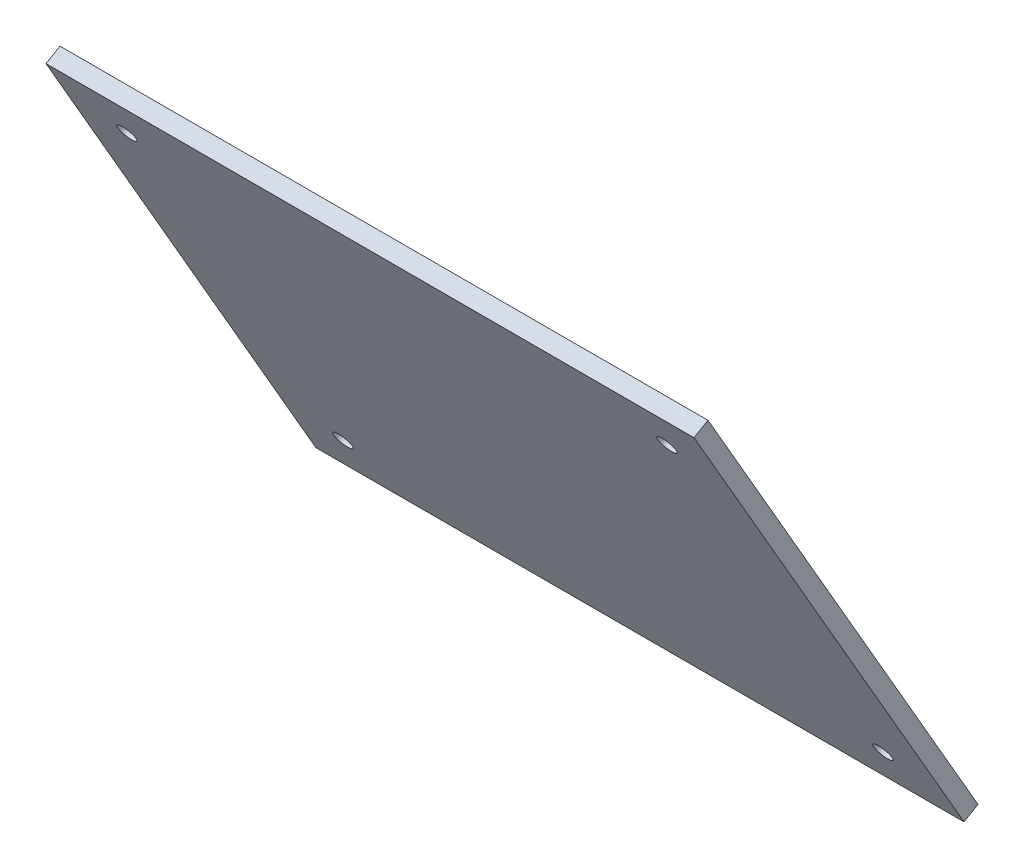
ISO-10303-21;
HEADER;
FILE_DESCRIPTION(('STEP AP214'),'2;1');
FILE_NAME('part.step','',(''),(''),'','','');
FILE_SCHEMA(('AUTOMOTIVE_DESIGN { 1 0 10303 214 1 1 1 1 }'));
ENDSEC;
DATA;
#1=APPLICATION_CONTEXT('core data for automotive mechanical design processes');
#2=APPLICATION_PROTOCOL_DEFINITION('international standard','automotive_design',2000,#1);
#3=PRODUCT_CONTEXT('',#1,'mechanical');
#4=PRODUCT('Part','Part','',(#3));
#5=PRODUCT_RELATED_PRODUCT_CATEGORY('part','',(#4));
#6=PRODUCT_DEFINITION_FORMATION('','',#4);
#7=PRODUCT_DEFINITION_CONTEXT('part definition',#1,'design');
#8=PRODUCT_DEFINITION('design','',#6,#7);
#9=PRODUCT_DEFINITION_SHAPE('','',#8);
#10=(LENGTH_UNIT() NAMED_UNIT(*) SI_UNIT(.MILLI.,.METRE.));
#11=(NAMED_UNIT(*) PLANE_ANGLE_UNIT() SI_UNIT($,.RADIAN.));
#12=(NAMED_UNIT(*) SI_UNIT($,.STERADIAN.) SOLID_ANGLE_UNIT());
#13=UNCERTAINTY_MEASURE_WITH_UNIT(LENGTH_MEASURE(1.E-05),#10,'distance_accuracy_value','');
#14=(GEOMETRIC_REPRESENTATION_CONTEXT(3) GLOBAL_UNCERTAINTY_ASSIGNED_CONTEXT((#13)) GLOBAL_UNIT_ASSIGNED_CONTEXT((#10,
#11,#12)) REPRESENTATION_CONTEXT('',''));
#15=CARTESIAN_POINT('',(0.,0.,0.));
#16=DIRECTION('',(0.,0.,1.));
#17=DIRECTION('',(1.,0.,0.));
#18=AXIS2_PLACEMENT_3D('',#15,#16,#17);
#19=CARTESIAN_POINT('',(0.,1.500029810778,2.701892219648E-05));
#20=DIRECTION('',(0.,-0.50000000000019,0.866025403784329));
#21=DIRECTION('',(0.,-0.866025403784329,-0.50000000000019));
#22=AXIS2_PLACEMENT_3D('',#19,#20,#21);
#23=PLANE('',#22);
#24=CARTESIAN_POINT('',(110.,79.442316151378,45.000027018922));
#25=DIRECTION('',(0.,-0.50000000000019,0.866025403784329));
#26=DIRECTION('',(0.,-0.866025403784329,-0.50000000000019));
#27=AXIS2_PLACEMENT_3D('',#24,#25,#26);
#28=CIRCLE('',#27,1.7);
#29=CARTESIAN_POINT('',(110.,77.9700729649446,44.1500270189217));
#30=VERTEX_POINT('',#29);
#31=EDGE_CURVE('E90',#30,#30,#28,.T.);
#32=ORIENTED_EDGE('',*,*,#31,.T.);
#33=EDGE_LOOP('',(#32));
#34=FACE_BOUND('',#33,.T.);
#35=CARTESIAN_POINT('',(10.,79.442316151378,45.000027018922));
#36=DIRECTION('',(0.,-0.50000000000019,0.866025403784329));
#37=DIRECTION('',(0.,-0.866025403784329,-0.50000000000019));
#38=AXIS2_PLACEMENT_3D('',#35,#36,#37);
#39=CIRCLE('',#38,1.7);
#40=CARTESIAN_POINT('',(10.,77.9700729649446,44.1500270189217));
#41=VERTEX_POINT('',#40);
#42=EDGE_CURVE('E94',#41,#41,#39,.T.);
#43=ORIENTED_EDGE('',*,*,#42,.T.);
#44=EDGE_LOOP('',(#43));
#45=FACE_BOUND('',#44,.T.);
#46=CARTESIAN_POINT('',(110.,10.160283848622,5.000027018922));
#47=DIRECTION('',(0.,-0.50000000000019,0.866025403784329));
#48=DIRECTION('',(0.,-0.866025403784329,-0.50000000000019));
#49=AXIS2_PLACEMENT_3D('',#46,#47,#48);
#50=CIRCLE('',#49,1.7);
#51=CARTESIAN_POINT('',(110.,8.68804066218864,4.15002701892168));
#52=VERTEX_POINT('',#51);
#53=EDGE_CURVE('E96',#52,#52,#50,.T.);
#54=ORIENTED_EDGE('',*,*,#53,.T.);
#55=EDGE_LOOP('',(#54));
#56=FACE_BOUND('',#55,.T.);
#57=CARTESIAN_POINT('',(10.,10.160283848622,5.000027018922));
#58=DIRECTION('',(0.,-0.50000000000019,0.866025403784329));
#59=DIRECTION('',(0.,-0.866025403784329,-0.50000000000019));
#60=AXIS2_PLACEMENT_3D('',#57,#58,#59);
#61=CIRCLE('',#60,1.7);
#62=CARTESIAN_POINT('',(10.,8.68804066218864,4.15002701892168));
#63=VERTEX_POINT('',#62);
#64=EDGE_CURVE('E19',#63,#63,#61,.T.);
#65=ORIENTED_EDGE('',*,*,#64,.T.);
#66=EDGE_LOOP('',(#65));
#67=FACE_BOUND('',#66,.T.);
#68=DIRECTION('',(0.,0.86602540378444,0.499999999999998));
#69=VECTOR('',#68,1.);
#70=CARTESIAN_POINT('',(120.,1.500029810778,2.701892219648E-05));
#71=LINE('',#70,#69);
#72=CARTESIAN_POINT('',(120.,1.500029810778,2.70189221965314E-05));
#73=VERTEX_POINT('',#72);
#74=CARTESIAN_POINT('',(120.,88.1025701892165,50.0000270189316));
#75=VERTEX_POINT('',#74);
#76=EDGE_CURVE('E61',#73,#75,#71,.T.);
#77=ORIENTED_EDGE('',*,*,#76,.F.);
#78=DIRECTION('',(1.,0.,0.));
#79=VECTOR('',#78,1.);
#80=CARTESIAN_POINT('',(0.,1.500029810778,2.701892219648E-05));
#81=LINE('',#80,#79);
#82=CARTESIAN_POINT('',(0.,1.500029810778,2.70189221965314E-05));
#83=VERTEX_POINT('',#82);
#84=EDGE_CURVE('E55',#73,#83,#81,.F.);
#85=ORIENTED_EDGE('',*,*,#84,.T.);
#86=DIRECTION('',(0.,0.86602540378444,0.499999999999998));
#87=VECTOR('',#86,1.);
#88=CARTESIAN_POINT('',(0.,1.500029810778,2.701892219648E-05));
#89=LINE('',#88,#87);
#90=CARTESIAN_POINT('',(0.,88.1025701892165,50.0000270189316));
#91=VERTEX_POINT('',#90);
#92=EDGE_CURVE('E59',#83,#91,#89,.T.);
#93=ORIENTED_EDGE('',*,*,#92,.T.);
#94=DIRECTION('',(1.,0.,0.));
#95=VECTOR('',#94,1.);
#96=CARTESIAN_POINT('',(0.,88.102570189222,50.000027018922));
#97=LINE('',#96,#95);
#98=EDGE_CURVE('E105',#75,#91,#97,.F.);
#99=ORIENTED_EDGE('',*,*,#98,.F.);
#100=EDGE_LOOP('',(#77,#85,#93,#99));
#101=FACE_BOUND('',#100,.T.);
#102=ADVANCED_FACE('F16',(#34,#45,#56,#67,#101),#23,.F.);
#103=CARTESIAN_POINT('',(0.,1.500029810778,2.701892219648E-05));
#104=DIRECTION('',(1.,0.,0.));
#105=DIRECTION('',(0.,0.,-1.));
#106=AXIS2_PLACEMENT_3D('',#103,#104,#105);
#107=PLANE('',#106);
#108=DIRECTION('',(0.,-0.50000000000019,0.866025403784329));
#109=VECTOR('',#108,1.);
#110=CARTESIAN_POINT('',(0.,88.102570189222,50.000027018922));
#111=LINE('',#110,#109);
#112=CARTESIAN_POINT('',(0.,86.6025701892192,52.5981032302797));
#113=VERTEX_POINT('',#112);
#114=EDGE_CURVE('E69',#91,#113,#111,.T.);
#115=ORIENTED_EDGE('',*,*,#114,.F.);
#116=ORIENTED_EDGE('',*,*,#92,.F.);
#117=DIRECTION('',(0.,-0.50000000000019,0.866025403784329));
#118=VECTOR('',#117,1.);
#119=CARTESIAN_POINT('',(0.,1.500029810778,2.701892219648E-05));
#120=LINE('',#119,#118);
#121=CARTESIAN_POINT('',(0.,2.98107779645494E-05,2.59810323027494));
#122=VERTEX_POINT('',#121);
#123=EDGE_CURVE('E63',#83,#122,#120,.T.);
#124=ORIENTED_EDGE('',*,*,#123,.T.);
#125=DIRECTION('',(0.,-0.866025403784329,-0.50000000000019));
#126=VECTOR('',#125,1.);
#127=CARTESIAN_POINT('',(0.,2.981077805941E-05,2.598103230275));
#128=LINE('',#127,#126);
#129=EDGE_CURVE('E93',#113,#122,#128,.T.);
#130=ORIENTED_EDGE('',*,*,#129,.F.);
#131=EDGE_LOOP('',(#115,#116,#124,#130));
#132=FACE_BOUND('',#131,.T.);
#133=ADVANCED_FACE('F66',(#132),#107,.F.);
#134=CARTESIAN_POINT('',(0.,1.500029810778,2.701892219648E-05));
#135=DIRECTION('',(0.,0.866025403784329,0.50000000000019));
#136=DIRECTION('',(0.,-0.50000000000019,0.866025403784329));
#137=AXIS2_PLACEMENT_3D('',#134,#135,#136);
#138=PLANE('',#137);
#139=DIRECTION('',(1.,0.,0.));
#140=VECTOR('',#139,1.);
#141=CARTESIAN_POINT('',(0.,2.981077805941E-05,2.598103230275));
#142=LINE('',#141,#140);
#143=CARTESIAN_POINT('',(120.,2.98107778647974E-05,2.59810323027489));
#144=VERTEX_POINT('',#143);
#145=EDGE_CURVE('E74',#122,#144,#142,.T.);
#146=ORIENTED_EDGE('',*,*,#145,.F.);
#147=ORIENTED_EDGE('',*,*,#123,.F.);
#148=ORIENTED_EDGE('',*,*,#84,.F.);
#149=DIRECTION('',(0.,0.500000000000059,-0.866025403784405));
#150=VECTOR('',#149,1.);
#151=CARTESIAN_POINT('',(120.,2.9810778059405E-05,2.598103230275));
#152=LINE('',#151,#150);
#153=EDGE_CURVE('E76',#144,#73,#152,.T.);
#154=ORIENTED_EDGE('',*,*,#153,.F.);
#155=EDGE_LOOP('',(#146,#147,#148,#154));
#156=FACE_BOUND('',#155,.T.);
#157=ADVANCED_FACE('F72',(#156),#138,.F.);
#158=CARTESIAN_POINT('',(120.,1.500029810778,2.701892219648E-05));
#159=DIRECTION('',(1.,0.,0.));
#160=DIRECTION('',(0.,0.,-1.));
#161=AXIS2_PLACEMENT_3D('',#158,#159,#160);
#162=PLANE('',#161);
#163=DIRECTION('',(0.,-0.50000000000019,0.866025403784329));
#164=VECTOR('',#163,1.);
#165=CARTESIAN_POINT('',(120.,88.102570189222,50.000027018922));
#166=LINE('',#165,#164);
#167=CARTESIAN_POINT('',(120.,86.6025701892192,52.5981032302797));
#168=VERTEX_POINT('',#167);
#169=EDGE_CURVE('E34',#168,#75,#166,.F.);
#170=ORIENTED_EDGE('',*,*,#169,.F.);
#171=DIRECTION('',(0.,-0.866025403784329,-0.50000000000019));
#172=VECTOR('',#171,1.);
#173=CARTESIAN_POINT('',(120.,2.981077805941E-05,2.598103230275));
#174=LINE('',#173,#172);
#175=EDGE_CURVE('E112',#144,#168,#174,.F.);
#176=ORIENTED_EDGE('',*,*,#175,.F.);
#177=ORIENTED_EDGE('',*,*,#153,.T.);
#178=ORIENTED_EDGE('',*,*,#76,.T.);
#179=EDGE_LOOP('',(#170,#176,#177,#178));
#180=FACE_BOUND('',#179,.T.);
#181=ADVANCED_FACE('F110',(#180),#162,.T.);
#182=CARTESIAN_POINT('',(0.,88.102570189222,50.000027018922));
#183=DIRECTION('',(0.,0.866025403784329,0.50000000000019));
#184=DIRECTION('',(0.,-0.50000000000019,0.866025403784329));
#185=AXIS2_PLACEMENT_3D('',#182,#183,#184);
#186=PLANE('',#185);
#187=DIRECTION('',(1.,0.,0.));
#188=VECTOR('',#187,1.);
#189=CARTESIAN_POINT('',(0.,86.602570189211,52.598103230294));
#190=LINE('',#189,#188);
#191=EDGE_CURVE('E89',#168,#113,#190,.F.);
#192=ORIENTED_EDGE('',*,*,#191,.F.);
#193=ORIENTED_EDGE('',*,*,#169,.T.);
#194=ORIENTED_EDGE('',*,*,#98,.T.);
#195=ORIENTED_EDGE('',*,*,#114,.T.);
#196=EDGE_LOOP('',(#192,#193,#194,#195));
#197=FACE_BOUND('',#196,.T.);
#198=ADVANCED_FACE('F118',(#197),#186,.T.);
#199=CARTESIAN_POINT('',(10.,10.160283848622,5.000027018922));
#200=DIRECTION('',(0.,-0.50000000000019,0.866025403784329));
#201=DIRECTION('',(0.,-0.866025403784329,-0.50000000000019));
#202=AXIS2_PLACEMENT_3D('',#199,#200,#201);
#203=CYLINDRICAL_SURFACE('',#202,1.7);
#204=ORIENTED_EDGE('',*,*,#64,.F.);
#205=EDGE_LOOP('',(#204));
#206=FACE_BOUND('',#205,.T.);
#207=CARTESIAN_POINT('',(10.,8.66028384862157,7.59810323027475));
#208=DIRECTION('',(0.,-0.50000000000019,0.866025403784329));
#209=DIRECTION('',(0.,-0.866025403784329,-0.50000000000019));
#210=AXIS2_PLACEMENT_3D('',#207,#208,#209);
#211=CIRCLE('',#210,1.7);
#212=CARTESIAN_POINT('',(10.,7.18804066218821,6.74810323027443));
#213=VERTEX_POINT('',#212);
#214=EDGE_CURVE('E86',#213,#213,#211,.F.);
#215=ORIENTED_EDGE('',*,*,#214,.F.);
#216=EDGE_LOOP('',(#215));
#217=FACE_BOUND('',#216,.T.);
#218=ADVANCED_FACE('F120',(#206,#217),#203,.F.);
#219=CARTESIAN_POINT('',(110.,10.160283848622,5.000027018922));
#220=DIRECTION('',(0.,-0.50000000000019,0.866025403784329));
#221=DIRECTION('',(0.,-0.866025403784329,-0.50000000000019));
#222=AXIS2_PLACEMENT_3D('',#219,#220,#221);
#223=CYLINDRICAL_SURFACE('',#222,1.7);
#224=ORIENTED_EDGE('',*,*,#53,.F.);
#225=EDGE_LOOP('',(#224));
#226=FACE_BOUND('',#225,.T.);
#227=CARTESIAN_POINT('',(110.,8.66028384862157,7.59810323027475));
#228=DIRECTION('',(0.,-0.50000000000019,0.866025403784329));
#229=DIRECTION('',(0.,-0.866025403784329,-0.50000000000019));
#230=AXIS2_PLACEMENT_3D('',#227,#228,#229);
#231=CIRCLE('',#230,1.7);
#232=CARTESIAN_POINT('',(110.,7.18804066218821,6.74810323027443));
#233=VERTEX_POINT('',#232);
#234=EDGE_CURVE('E83',#233,#233,#231,.F.);
#235=ORIENTED_EDGE('',*,*,#234,.F.);
#236=EDGE_LOOP('',(#235));
#237=FACE_BOUND('',#236,.T.);
#238=ADVANCED_FACE('F127',(#226,#237),#223,.F.);
#239=CARTESIAN_POINT('',(10.,79.442316151378,45.000027018922));
#240=DIRECTION('',(0.,-0.50000000000019,0.866025403784329));
#241=DIRECTION('',(0.,-0.866025403784329,-0.50000000000019));
#242=AXIS2_PLACEMENT_3D('',#239,#240,#241);
#243=CYLINDRICAL_SURFACE('',#242,1.7);
#244=ORIENTED_EDGE('',*,*,#42,.F.);
#245=EDGE_LOOP('',(#244));
#246=FACE_BOUND('',#245,.T.);
#247=CARTESIAN_POINT('',(10.,77.9423161513776,47.5981032302748));
#248=DIRECTION('',(0.,-0.50000000000019,0.866025403784329));
#249=DIRECTION('',(0.,-0.866025403784329,-0.50000000000019));
#250=AXIS2_PLACEMENT_3D('',#247,#248,#249);
#251=CIRCLE('',#250,1.7);
#252=CARTESIAN_POINT('',(10.,76.4700729649442,46.7481032302744));
#253=VERTEX_POINT('',#252);
#254=EDGE_CURVE('E25',#253,#253,#251,.F.);
#255=ORIENTED_EDGE('',*,*,#254,.F.);
#256=EDGE_LOOP('',(#255));
#257=FACE_BOUND('',#256,.T.);
#258=ADVANCED_FACE('F138',(#246,#257),#243,.F.);
#259=CARTESIAN_POINT('',(110.,79.442316151378,45.000027018922));
#260=DIRECTION('',(0.,-0.50000000000019,0.866025403784329));
#261=DIRECTION('',(0.,-0.866025403784329,-0.50000000000019));
#262=AXIS2_PLACEMENT_3D('',#259,#260,#261);
#263=CYLINDRICAL_SURFACE('',#262,1.7);
#264=ORIENTED_EDGE('',*,*,#31,.F.);
#265=EDGE_LOOP('',(#264));
#266=FACE_BOUND('',#265,.T.);
#267=CARTESIAN_POINT('',(110.,77.9423161513776,47.5981032302748));
#268=DIRECTION('',(0.,-0.50000000000019,0.866025403784329));
#269=DIRECTION('',(0.,-0.866025403784329,-0.50000000000019));
#270=AXIS2_PLACEMENT_3D('',#267,#268,#269);
#271=CIRCLE('',#270,1.7);
#272=CARTESIAN_POINT('',(110.,76.4700729649442,46.7481032302744));
#273=VERTEX_POINT('',#272);
#274=EDGE_CURVE('E11',#273,#273,#271,.F.);
#275=ORIENTED_EDGE('',*,*,#274,.F.);
#276=EDGE_LOOP('',(#275));
#277=FACE_BOUND('',#276,.T.);
#278=ADVANCED_FACE('F132',(#266,#277),#263,.F.);
#279=CARTESIAN_POINT('',(0.,2.981077805941E-05,2.598103230275));
#280=DIRECTION('',(0.,-0.50000000000019,0.866025403784329));
#281=DIRECTION('',(0.,-0.866025403784329,-0.50000000000019));
#282=AXIS2_PLACEMENT_3D('',#279,#280,#281);
#283=PLANE('',#282);
#284=ORIENTED_EDGE('',*,*,#274,.T.);
#285=EDGE_LOOP('',(#284));
#286=FACE_BOUND('',#285,.T.);
#287=ORIENTED_EDGE('',*,*,#254,.T.);
#288=EDGE_LOOP('',(#287));
#289=FACE_BOUND('',#288,.T.);
#290=ORIENTED_EDGE('',*,*,#234,.T.);
#291=EDGE_LOOP('',(#290));
#292=FACE_BOUND('',#291,.T.);
#293=ORIENTED_EDGE('',*,*,#214,.T.);
#294=EDGE_LOOP('',(#293));
#295=FACE_BOUND('',#294,.T.);
#296=ORIENTED_EDGE('',*,*,#175,.T.);
#297=ORIENTED_EDGE('',*,*,#191,.T.);
#298=ORIENTED_EDGE('',*,*,#129,.T.);
#299=ORIENTED_EDGE('',*,*,#145,.T.);
#300=EDGE_LOOP('',(#296,#297,#298,#299));
#301=FACE_BOUND('',#300,.T.);
#302=ADVANCED_FACE('F116',(#286,#289,#292,#295,#301),#283,.T.);
#303=CLOSED_SHELL('',(#102,#133,#157,#181,#198,#218,#238,#258,#278,#302));
#304=MANIFOLD_SOLID_BREP('B1',#303);
#305=ADVANCED_BREP_SHAPE_REPRESENTATION('',(#18,#304),#14);
#306=SHAPE_DEFINITION_REPRESENTATION(#9,#305);
ENDSEC;
END-ISO-10303-21;
